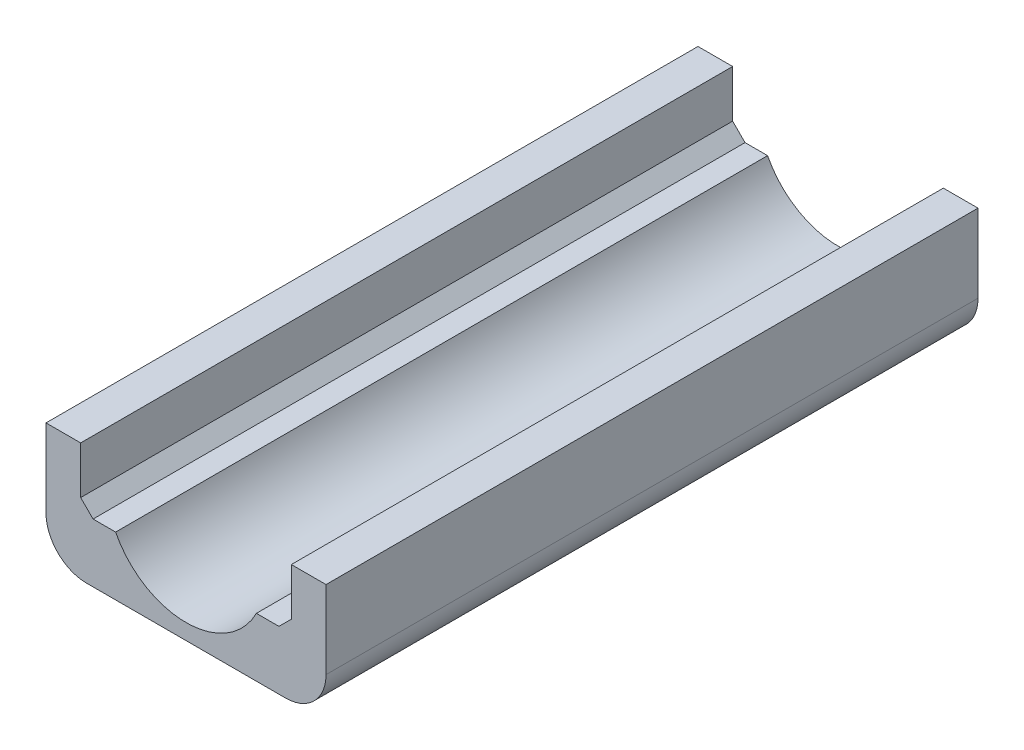
ISO-10303-21;
HEADER;
FILE_DESCRIPTION(('STEP AP214'),'2;1');
FILE_NAME('part.step','',(''),(''),'','','');
FILE_SCHEMA(('AUTOMOTIVE_DESIGN { 1 0 10303 214 1 1 1 1 }'));
ENDSEC;
DATA;
#1=APPLICATION_CONTEXT('core data for automotive mechanical design processes');
#2=APPLICATION_PROTOCOL_DEFINITION('international standard','automotive_design',2000,#1);
#3=PRODUCT_CONTEXT('',#1,'mechanical');
#4=PRODUCT('Part','Part','',(#3));
#5=PRODUCT_RELATED_PRODUCT_CATEGORY('part','',(#4));
#6=PRODUCT_DEFINITION_FORMATION('','',#4);
#7=PRODUCT_DEFINITION_CONTEXT('part definition',#1,'design');
#8=PRODUCT_DEFINITION('design','',#6,#7);
#9=PRODUCT_DEFINITION_SHAPE('','',#8);
#10=(LENGTH_UNIT() NAMED_UNIT(*) SI_UNIT(.MILLI.,.METRE.));
#11=(NAMED_UNIT(*) PLANE_ANGLE_UNIT() SI_UNIT($,.RADIAN.));
#12=(NAMED_UNIT(*) SI_UNIT($,.STERADIAN.) SOLID_ANGLE_UNIT());
#13=UNCERTAINTY_MEASURE_WITH_UNIT(LENGTH_MEASURE(1.E-05),#10,'distance_accuracy_value','');
#14=(GEOMETRIC_REPRESENTATION_CONTEXT(3) GLOBAL_UNCERTAINTY_ASSIGNED_CONTEXT((#13)) GLOBAL_UNIT_ASSIGNED_CONTEXT((#10,
#11,#12)) REPRESENTATION_CONTEXT('',''));
#15=CARTESIAN_POINT('',(0.,0.,0.));
#16=DIRECTION('',(0.,0.,1.));
#17=DIRECTION('',(1.,0.,0.));
#18=AXIS2_PLACEMENT_3D('',#15,#16,#17);
#19=CARTESIAN_POINT('',(12.0761564946184,23.3589104479386,161.));
#20=DIRECTION('',(0.,0.,-1.));
#21=DIRECTION('',(-1.,0.,0.));
#22=AXIS2_PLACEMENT_3D('',#19,#20,#21);
#23=CYLINDRICAL_SURFACE('',#22,19.5);
#24=CARTESIAN_POINT('',(12.0761564946184,23.3589104479386,0.));
#25=DIRECTION('',(0.,0.,-1.));
#26=DIRECTION('',(1.,0.,0.));
#27=AXIS2_PLACEMENT_3D('',#24,#25,#26);
#28=CIRCLE('',#27,19.5);
#29=CARTESIAN_POINT('',(29.4569599123131,14.5182276374623,0.));
#30=VERTEX_POINT('',#29);
#31=CARTESIAN_POINT('',(-5.30464692307629,14.5182276374623,0.));
#32=VERTEX_POINT('',#31);
#33=EDGE_CURVE('E182',#30,#32,#28,.T.);
#34=ORIENTED_EDGE('',*,*,#33,.T.);
#35=DIRECTION('',(0.,0.,-1.));
#36=VECTOR('',#35,1.);
#37=CARTESIAN_POINT('',(-5.30464692307629,14.5182276374623,161.));
#38=LINE('',#37,#36);
#39=CARTESIAN_POINT('',(-5.30464692307629,14.5182276374623,161.));
#40=VERTEX_POINT('',#39);
#41=EDGE_CURVE('E11',#40,#32,#38,.T.);
#42=ORIENTED_EDGE('',*,*,#41,.F.);
#43=CARTESIAN_POINT('',(12.0761564946184,23.3589104479386,161.));
#44=DIRECTION('',(0.,0.,-1.));
#45=DIRECTION('',(1.,0.,0.));
#46=AXIS2_PLACEMENT_3D('',#43,#44,#45);
#47=CIRCLE('',#46,19.5);
#48=CARTESIAN_POINT('',(29.4569599123131,14.5182276374623,161.));
#49=VERTEX_POINT('',#48);
#50=EDGE_CURVE('E222',#49,#40,#47,.T.);
#51=ORIENTED_EDGE('',*,*,#50,.F.);
#52=DIRECTION('',(0.,0.,-1.));
#53=VECTOR('',#52,1.);
#54=CARTESIAN_POINT('',(29.4569599123131,14.5182276374623,161.));
#55=LINE('',#54,#53);
#56=EDGE_CURVE('E178',#49,#30,#55,.T.);
#57=ORIENTED_EDGE('',*,*,#56,.T.);
#58=EDGE_LOOP('',(#34,#42,#51,#57));
#59=FACE_BOUND('',#58,.T.);
#60=ADVANCED_FACE('F45',(#59),#23,.F.);
#61=CARTESIAN_POINT('',(-10.8746469230763,14.5182276374622,161.));
#62=DIRECTION('',(0.,-1.,0.));
#63=DIRECTION('',(1.,0.,0.));
#64=AXIS2_PLACEMENT_3D('',#61,#62,#63);
#65=PLANE('',#64);
#66=DIRECTION('',(-1.,0.,0.));
#67=VECTOR('',#66,1.);
#68=CARTESIAN_POINT('',(-10.8746469230763,14.5182276374622,0.));
#69=LINE('',#68,#67);
#70=CARTESIAN_POINT('',(-10.8746469230763,14.5182276374622,0.));
#71=VERTEX_POINT('',#70);
#72=EDGE_CURVE('E186',#32,#71,#69,.T.);
#73=ORIENTED_EDGE('',*,*,#72,.T.);
#74=DIRECTION('',(0.,0.,-1.));
#75=VECTOR('',#74,1.);
#76=CARTESIAN_POINT('',(-10.8746469230763,14.5182276374622,161.));
#77=LINE('',#76,#75);
#78=CARTESIAN_POINT('',(-10.8746469230763,14.5182276374622,161.));
#79=VERTEX_POINT('',#78);
#80=EDGE_CURVE('E54',#79,#71,#77,.T.);
#81=ORIENTED_EDGE('',*,*,#80,.F.);
#82=DIRECTION('',(-1.,0.,0.));
#83=VECTOR('',#82,1.);
#84=CARTESIAN_POINT('',(-10.8746469230763,14.5182276374622,161.));
#85=LINE('',#84,#83);
#86=EDGE_CURVE('E123',#40,#79,#85,.T.);
#87=ORIENTED_EDGE('',*,*,#86,.F.);
#88=ORIENTED_EDGE('',*,*,#41,.T.);
#89=EDGE_LOOP('',(#73,#81,#87,#88));
#90=FACE_BOUND('',#89,.T.);
#91=ADVANCED_FACE('F330',(#90),#65,.F.);
#92=CARTESIAN_POINT('',(-13.936419285614,17.58,161.));
#93=DIRECTION('',(-0.707106781186547,-0.707106781186547,0.));
#94=DIRECTION('',(0.707106781186548,-0.707106781186548,0.));
#95=AXIS2_PLACEMENT_3D('',#92,#93,#94);
#96=PLANE('',#95);
#97=DIRECTION('',(-0.707106781186548,0.707106781186548,0.));
#98=VECTOR('',#97,1.);
#99=CARTESIAN_POINT('',(-13.936419285614,17.58,0.));
#100=LINE('',#99,#98);
#101=CARTESIAN_POINT('',(-13.936419285614,17.58,0.));
#102=VERTEX_POINT('',#101);
#103=EDGE_CURVE('E189',#71,#102,#100,.T.);
#104=ORIENTED_EDGE('',*,*,#103,.T.);
#105=DIRECTION('',(0.,0.,-1.));
#106=VECTOR('',#105,1.);
#107=CARTESIAN_POINT('',(-13.936419285614,17.58,161.));
#108=LINE('',#107,#106);
#109=CARTESIAN_POINT('',(-13.936419285614,17.58,161.));
#110=VERTEX_POINT('',#109);
#111=EDGE_CURVE('E257',#110,#102,#108,.T.);
#112=ORIENTED_EDGE('',*,*,#111,.F.);
#113=DIRECTION('',(-0.707106781186548,0.707106781186548,0.));
#114=VECTOR('',#113,1.);
#115=CARTESIAN_POINT('',(-13.936419285614,17.58,161.));
#116=LINE('',#115,#114);
#117=EDGE_CURVE('E267',#79,#110,#116,.T.);
#118=ORIENTED_EDGE('',*,*,#117,.F.);
#119=ORIENTED_EDGE('',*,*,#80,.T.);
#120=EDGE_LOOP('',(#104,#112,#118,#119));
#121=FACE_BOUND('',#120,.T.);
#122=ADVANCED_FACE('F265',(#121),#96,.F.);
#123=CARTESIAN_POINT('',(-13.936419285614,29.27,161.));
#124=DIRECTION('',(-1.,0.,0.));
#125=DIRECTION('',(0.,0.,1.));
#126=AXIS2_PLACEMENT_3D('',#123,#124,#125);
#127=PLANE('',#126);
#128=DIRECTION('',(0.,1.,0.));
#129=VECTOR('',#128,1.);
#130=CARTESIAN_POINT('',(-13.936419285614,29.27,0.));
#131=LINE('',#130,#129);
#132=CARTESIAN_POINT('',(-13.936419285614,29.27,0.));
#133=VERTEX_POINT('',#132);
#134=EDGE_CURVE('E192',#102,#133,#131,.T.);
#135=ORIENTED_EDGE('',*,*,#134,.T.);
#136=DIRECTION('',(0.,0.,-1.));
#137=VECTOR('',#136,1.);
#138=CARTESIAN_POINT('',(-13.936419285614,29.27,161.));
#139=LINE('',#138,#137);
#140=CARTESIAN_POINT('',(-13.936419285614,29.27,161.));
#141=VERTEX_POINT('',#140);
#142=EDGE_CURVE('E253',#141,#133,#139,.T.);
#143=ORIENTED_EDGE('',*,*,#142,.F.);
#144=DIRECTION('',(0.,1.,0.));
#145=VECTOR('',#144,1.);
#146=CARTESIAN_POINT('',(-13.936419285614,29.27,161.));
#147=LINE('',#146,#145);
#148=EDGE_CURVE('E286',#110,#141,#147,.T.);
#149=ORIENTED_EDGE('',*,*,#148,.F.);
#150=ORIENTED_EDGE('',*,*,#111,.T.);
#151=EDGE_LOOP('',(#135,#143,#149,#150));
#152=FACE_BOUND('',#151,.T.);
#153=ADVANCED_FACE('F276',(#152),#127,.F.);
#154=CARTESIAN_POINT('',(-22.496419285614,29.27,161.));
#155=DIRECTION('',(0.,-1.,0.));
#156=DIRECTION('',(1.,0.,0.));
#157=AXIS2_PLACEMENT_3D('',#154,#155,#156);
#158=PLANE('',#157);
#159=DIRECTION('',(-1.,0.,0.));
#160=VECTOR('',#159,1.);
#161=CARTESIAN_POINT('',(-22.496419285614,29.27,0.));
#162=LINE('',#161,#160);
#163=CARTESIAN_POINT('',(-22.496419285614,29.27,0.));
#164=VERTEX_POINT('',#163);
#165=EDGE_CURVE('E195',#133,#164,#162,.T.);
#166=ORIENTED_EDGE('',*,*,#165,.T.);
#167=DIRECTION('',(0.,0.,-1.));
#168=VECTOR('',#167,1.);
#169=CARTESIAN_POINT('',(-22.496419285614,29.27,161.));
#170=LINE('',#169,#168);
#171=CARTESIAN_POINT('',(-22.496419285614,29.27,161.));
#172=VERTEX_POINT('',#171);
#173=EDGE_CURVE('E249',#172,#164,#170,.T.);
#174=ORIENTED_EDGE('',*,*,#173,.F.);
#175=DIRECTION('',(-1.,0.,0.));
#176=VECTOR('',#175,1.);
#177=CARTESIAN_POINT('',(-22.496419285614,29.27,161.));
#178=LINE('',#177,#176);
#179=EDGE_CURVE('E282',#141,#172,#178,.T.);
#180=ORIENTED_EDGE('',*,*,#179,.F.);
#181=ORIENTED_EDGE('',*,*,#142,.T.);
#182=EDGE_LOOP('',(#166,#174,#180,#181));
#183=FACE_BOUND('',#182,.T.);
#184=ADVANCED_FACE('F280',(#183),#158,.F.);
#185=CARTESIAN_POINT('',(-22.496419285614,29.27,161.));
#186=DIRECTION('',(1.,0.,0.));
#187=DIRECTION('',(0.,0.,-1.));
#188=AXIS2_PLACEMENT_3D('',#185,#186,#187);
#189=PLANE('',#188);
#190=DIRECTION('',(0.,-1.,0.));
#191=VECTOR('',#190,1.);
#192=CARTESIAN_POINT('',(-22.496419285614,29.27,0.));
#193=LINE('',#192,#191);
#194=CARTESIAN_POINT('',(-22.496419285614,10.,0.));
#195=VERTEX_POINT('',#194);
#196=EDGE_CURVE('E198',#164,#195,#193,.T.);
#197=ORIENTED_EDGE('',*,*,#196,.T.);
#198=DIRECTION('',(0.,0.,-1.));
#199=VECTOR('',#198,1.);
#200=CARTESIAN_POINT('',(-22.496419285614,10.,161.));
#201=LINE('',#200,#199);
#202=CARTESIAN_POINT('',(-22.496419285614,10.,161.));
#203=VERTEX_POINT('',#202);
#204=EDGE_CURVE('E245',#203,#195,#201,.T.);
#205=ORIENTED_EDGE('',*,*,#204,.F.);
#206=DIRECTION('',(0.,-1.,0.));
#207=VECTOR('',#206,1.);
#208=CARTESIAN_POINT('',(-22.496419285614,29.27,161.));
#209=LINE('',#208,#207);
#210=EDGE_CURVE('E285',#172,#203,#209,.T.);
#211=ORIENTED_EDGE('',*,*,#210,.F.);
#212=ORIENTED_EDGE('',*,*,#173,.T.);
#213=EDGE_LOOP('',(#197,#205,#211,#212));
#214=FACE_BOUND('',#213,.T.);
#215=ADVANCED_FACE('F343',(#214),#189,.F.);
#216=CARTESIAN_POINT('',(-12.496419285614,10.,161.));
#217=DIRECTION('',(0.,0.,-1.));
#218=DIRECTION('',(-1.,0.,0.));
#219=AXIS2_PLACEMENT_3D('',#216,#217,#218);
#220=CYLINDRICAL_SURFACE('',#219,10.);
#221=CARTESIAN_POINT('',(-12.496419285614,10.,0.));
#222=DIRECTION('',(0.,0.,1.));
#223=DIRECTION('',(-1.,0.,0.));
#224=AXIS2_PLACEMENT_3D('',#221,#222,#223);
#225=CIRCLE('',#224,10.);
#226=CARTESIAN_POINT('',(-12.496419285614,0.,0.));
#227=VERTEX_POINT('',#226);
#228=EDGE_CURVE('E201',#195,#227,#225,.T.);
#229=ORIENTED_EDGE('',*,*,#228,.T.);
#230=DIRECTION('',(0.,0.,-1.));
#231=VECTOR('',#230,1.);
#232=CARTESIAN_POINT('',(-12.496419285614,0.,161.));
#233=LINE('',#232,#231);
#234=CARTESIAN_POINT('',(-12.496419285614,0.,161.));
#235=VERTEX_POINT('',#234);
#236=EDGE_CURVE('E241',#235,#227,#233,.T.);
#237=ORIENTED_EDGE('',*,*,#236,.F.);
#238=CARTESIAN_POINT('',(-12.496419285614,10.,161.));
#239=DIRECTION('',(0.,0.,1.));
#240=DIRECTION('',(-1.,0.,0.));
#241=AXIS2_PLACEMENT_3D('',#238,#239,#240);
#242=CIRCLE('',#241,10.);
#243=EDGE_CURVE('E290',#203,#235,#242,.T.);
#244=ORIENTED_EDGE('',*,*,#243,.F.);
#245=ORIENTED_EDGE('',*,*,#204,.T.);
#246=EDGE_LOOP('',(#229,#237,#244,#245));
#247=FACE_BOUND('',#246,.T.);
#248=ADVANCED_FACE('F346',(#247),#220,.T.);
#249=CARTESIAN_POINT('',(-12.496419285614,0.,161.));
#250=DIRECTION('',(0.,1.,0.));
#251=DIRECTION('',(0.,0.,1.));
#252=AXIS2_PLACEMENT_3D('',#249,#250,#251);
#253=PLANE('',#252);
#254=DIRECTION('',(1.,0.,0.));
#255=VECTOR('',#254,1.);
#256=CARTESIAN_POINT('',(-12.496419285614,0.,0.));
#257=LINE('',#256,#255);
#258=CARTESIAN_POINT('',(36.6487322748508,0.,0.));
#259=VERTEX_POINT('',#258);
#260=EDGE_CURVE('E204',#227,#259,#257,.T.);
#261=ORIENTED_EDGE('',*,*,#260,.T.);
#262=DIRECTION('',(0.,0.,-1.));
#263=VECTOR('',#262,1.);
#264=CARTESIAN_POINT('',(36.6487322748508,0.,161.));
#265=LINE('',#264,#263);
#266=CARTESIAN_POINT('',(36.6487322748508,0.,161.));
#267=VERTEX_POINT('',#266);
#268=EDGE_CURVE('E237',#267,#259,#265,.T.);
#269=ORIENTED_EDGE('',*,*,#268,.F.);
#270=DIRECTION('',(1.,0.,0.));
#271=VECTOR('',#270,1.);
#272=CARTESIAN_POINT('',(-12.496419285614,0.,161.));
#273=LINE('',#272,#271);
#274=EDGE_CURVE('E297',#235,#267,#273,.T.);
#275=ORIENTED_EDGE('',*,*,#274,.F.);
#276=ORIENTED_EDGE('',*,*,#236,.T.);
#277=EDGE_LOOP('',(#261,#269,#275,#276));
#278=FACE_BOUND('',#277,.T.);
#279=ADVANCED_FACE('F350',(#278),#253,.F.);
#280=CARTESIAN_POINT('',(36.6487322748509,10.,161.));
#281=DIRECTION('',(0.,0.,-1.));
#282=DIRECTION('',(-1.,0.,0.));
#283=AXIS2_PLACEMENT_3D('',#280,#281,#282);
#284=CYLINDRICAL_SURFACE('',#283,10.);
#285=CARTESIAN_POINT('',(36.6487322748509,10.,0.));
#286=DIRECTION('',(0.,0.,1.));
#287=DIRECTION('',(1.,0.,0.));
#288=AXIS2_PLACEMENT_3D('',#285,#286,#287);
#289=CIRCLE('',#288,10.);
#290=CARTESIAN_POINT('',(46.6487322748509,10.0000000000001,0.));
#291=VERTEX_POINT('',#290);
#292=EDGE_CURVE('E207',#259,#291,#289,.T.);
#293=ORIENTED_EDGE('',*,*,#292,.T.);
#294=DIRECTION('',(0.,0.,-1.));
#295=VECTOR('',#294,1.);
#296=CARTESIAN_POINT('',(46.6487322748509,10.0000000000001,161.));
#297=LINE('',#296,#295);
#298=CARTESIAN_POINT('',(46.6487322748509,10.0000000000001,161.));
#299=VERTEX_POINT('',#298);
#300=EDGE_CURVE('E233',#299,#291,#297,.T.);
#301=ORIENTED_EDGE('',*,*,#300,.F.);
#302=CARTESIAN_POINT('',(36.6487322748509,10.,161.));
#303=DIRECTION('',(0.,0.,1.));
#304=DIRECTION('',(1.,0.,0.));
#305=AXIS2_PLACEMENT_3D('',#302,#303,#304);
#306=CIRCLE('',#305,10.);
#307=EDGE_CURVE('E300',#267,#299,#306,.T.);
#308=ORIENTED_EDGE('',*,*,#307,.F.);
#309=ORIENTED_EDGE('',*,*,#268,.T.);
#310=EDGE_LOOP('',(#293,#301,#308,#309));
#311=FACE_BOUND('',#310,.T.);
#312=ADVANCED_FACE('F354',(#311),#284,.T.);
#313=CARTESIAN_POINT('',(46.6487322748509,29.27,161.));
#314=DIRECTION('',(-1.,0.,0.));
#315=DIRECTION('',(0.,0.,1.));
#316=AXIS2_PLACEMENT_3D('',#313,#314,#315);
#317=PLANE('',#316);
#318=DIRECTION('',(0.,1.,0.));
#319=VECTOR('',#318,1.);
#320=CARTESIAN_POINT('',(46.6487322748509,29.27,0.));
#321=LINE('',#320,#319);
#322=CARTESIAN_POINT('',(46.6487322748509,29.27,0.));
#323=VERTEX_POINT('',#322);
#324=EDGE_CURVE('E210',#291,#323,#321,.T.);
#325=ORIENTED_EDGE('',*,*,#324,.T.);
#326=DIRECTION('',(0.,0.,-1.));
#327=VECTOR('',#326,1.);
#328=CARTESIAN_POINT('',(46.6487322748509,29.27,161.));
#329=LINE('',#328,#327);
#330=CARTESIAN_POINT('',(46.6487322748509,29.27,161.));
#331=VERTEX_POINT('',#330);
#332=EDGE_CURVE('E229',#331,#323,#329,.T.);
#333=ORIENTED_EDGE('',*,*,#332,.F.);
#334=DIRECTION('',(0.,1.,0.));
#335=VECTOR('',#334,1.);
#336=CARTESIAN_POINT('',(46.6487322748509,29.27,161.));
#337=LINE('',#336,#335);
#338=EDGE_CURVE('E303',#299,#331,#337,.T.);
#339=ORIENTED_EDGE('',*,*,#338,.F.);
#340=ORIENTED_EDGE('',*,*,#300,.T.);
#341=EDGE_LOOP('',(#325,#333,#339,#340));
#342=FACE_BOUND('',#341,.T.);
#343=ADVANCED_FACE('F311',(#342),#317,.F.);
#344=CARTESIAN_POINT('',(46.6487322748509,29.27,161.));
#345=DIRECTION('',(0.,-1.,0.));
#346=DIRECTION('',(1.,0.,0.));
#347=AXIS2_PLACEMENT_3D('',#344,#345,#346);
#348=PLANE('',#347);
#349=DIRECTION('',(-1.,0.,0.));
#350=VECTOR('',#349,1.);
#351=CARTESIAN_POINT('',(46.6487322748509,29.27,0.));
#352=LINE('',#351,#350);
#353=CARTESIAN_POINT('',(38.0887322748509,29.27,0.));
#354=VERTEX_POINT('',#353);
#355=EDGE_CURVE('E213',#323,#354,#352,.T.);
#356=ORIENTED_EDGE('',*,*,#355,.T.);
#357=DIRECTION('',(0.,0.,-1.));
#358=VECTOR('',#357,1.);
#359=CARTESIAN_POINT('',(38.0887322748509,29.27,161.));
#360=LINE('',#359,#358);
#361=CARTESIAN_POINT('',(38.0887322748509,29.27,161.));
#362=VERTEX_POINT('',#361);
#363=EDGE_CURVE('E171',#362,#354,#360,.T.);
#364=ORIENTED_EDGE('',*,*,#363,.F.);
#365=DIRECTION('',(-1.,0.,0.));
#366=VECTOR('',#365,1.);
#367=CARTESIAN_POINT('',(46.6487322748509,29.27,161.));
#368=LINE('',#367,#366);
#369=EDGE_CURVE('E160',#331,#362,#368,.T.);
#370=ORIENTED_EDGE('',*,*,#369,.F.);
#371=ORIENTED_EDGE('',*,*,#332,.T.);
#372=EDGE_LOOP('',(#356,#364,#370,#371));
#373=FACE_BOUND('',#372,.T.);
#374=ADVANCED_FACE('F315',(#373),#348,.F.);
#375=CARTESIAN_POINT('',(38.0887322748509,29.27,161.));
#376=DIRECTION('',(1.,0.,0.));
#377=DIRECTION('',(0.,0.,-1.));
#378=AXIS2_PLACEMENT_3D('',#375,#376,#377);
#379=PLANE('',#378);
#380=DIRECTION('',(0.,-1.,0.));
#381=VECTOR('',#380,1.);
#382=CARTESIAN_POINT('',(38.0887322748509,29.27,0.));
#383=LINE('',#382,#381);
#384=CARTESIAN_POINT('',(38.0887322748509,17.58,0.));
#385=VERTEX_POINT('',#384);
#386=EDGE_CURVE('E169',#354,#385,#383,.T.);
#387=ORIENTED_EDGE('',*,*,#386,.T.);
#388=DIRECTION('',(0.,0.,-1.));
#389=VECTOR('',#388,1.);
#390=CARTESIAN_POINT('',(38.0887322748509,17.58,161.));
#391=LINE('',#390,#389);
#392=CARTESIAN_POINT('',(38.0887322748509,17.58,161.));
#393=VERTEX_POINT('',#392);
#394=EDGE_CURVE('E166',#393,#385,#391,.T.);
#395=ORIENTED_EDGE('',*,*,#394,.F.);
#396=DIRECTION('',(0.,-1.,0.));
#397=VECTOR('',#396,1.);
#398=CARTESIAN_POINT('',(38.0887322748509,29.27,161.));
#399=LINE('',#398,#397);
#400=EDGE_CURVE('E154',#362,#393,#399,.T.);
#401=ORIENTED_EDGE('',*,*,#400,.F.);
#402=ORIENTED_EDGE('',*,*,#363,.T.);
#403=EDGE_LOOP('',(#387,#395,#401,#402));
#404=FACE_BOUND('',#403,.T.);
#405=ADVANCED_FACE('F167',(#404),#379,.F.);
#406=CARTESIAN_POINT('',(38.0887322748509,17.58,161.));
#407=DIRECTION('',(0.707106781186546,-0.707106781186549,0.));
#408=DIRECTION('',(0.707106781186549,0.707106781186546,0.));
#409=AXIS2_PLACEMENT_3D('',#406,#407,#408);
#410=PLANE('',#409);
#411=DIRECTION('',(-0.707106781186549,-0.707106781186546,0.));
#412=VECTOR('',#411,1.);
#413=CARTESIAN_POINT('',(38.0887322748509,17.58,0.));
#414=LINE('',#413,#412);
#415=CARTESIAN_POINT('',(35.0269599123132,14.5182276374622,0.));
#416=VERTEX_POINT('',#415);
#417=EDGE_CURVE('E109',#385,#416,#414,.T.);
#418=ORIENTED_EDGE('',*,*,#417,.T.);
#419=DIRECTION('',(0.,0.,-1.));
#420=VECTOR('',#419,1.);
#421=CARTESIAN_POINT('',(35.0269599123132,14.5182276374622,161.));
#422=LINE('',#421,#420);
#423=CARTESIAN_POINT('',(35.0269599123132,14.5182276374622,161.));
#424=VERTEX_POINT('',#423);
#425=EDGE_CURVE('E172',#424,#416,#422,.T.);
#426=ORIENTED_EDGE('',*,*,#425,.F.);
#427=DIRECTION('',(-0.707106781186549,-0.707106781186546,0.));
#428=VECTOR('',#427,1.);
#429=CARTESIAN_POINT('',(38.0887322748509,17.58,161.));
#430=LINE('',#429,#428);
#431=EDGE_CURVE('E158',#393,#424,#430,.T.);
#432=ORIENTED_EDGE('',*,*,#431,.F.);
#433=ORIENTED_EDGE('',*,*,#394,.T.);
#434=EDGE_LOOP('',(#418,#426,#432,#433));
#435=FACE_BOUND('',#434,.T.);
#436=ADVANCED_FACE('F174',(#435),#410,.F.);
#437=CARTESIAN_POINT('',(35.0269599123132,14.5182276374622,161.));
#438=DIRECTION('',(0.,-1.,0.));
#439=DIRECTION('',(1.,0.,0.));
#440=AXIS2_PLACEMENT_3D('',#437,#438,#439);
#441=PLANE('',#440);
#442=DIRECTION('',(-1.,0.,0.));
#443=VECTOR('',#442,1.);
#444=CARTESIAN_POINT('',(35.0269599123132,14.5182276374622,0.));
#445=LINE('',#444,#443);
#446=EDGE_CURVE('E115',#416,#30,#445,.T.);
#447=ORIENTED_EDGE('',*,*,#446,.T.);
#448=ORIENTED_EDGE('',*,*,#56,.F.);
#449=DIRECTION('',(-1.,0.,0.));
#450=VECTOR('',#449,1.);
#451=CARTESIAN_POINT('',(35.0269599123132,14.5182276374622,161.));
#452=LINE('',#451,#450);
#453=EDGE_CURVE('E62',#424,#49,#452,.T.);
#454=ORIENTED_EDGE('',*,*,#453,.F.);
#455=ORIENTED_EDGE('',*,*,#425,.T.);
#456=EDGE_LOOP('',(#447,#448,#454,#455));
#457=FACE_BOUND('',#456,.T.);
#458=ADVANCED_FACE('F319',(#457),#441,.F.);
#459=CARTESIAN_POINT('',(12.0761564946184,23.3589104479386,161.));
#460=DIRECTION('',(0.,0.,1.));
#461=DIRECTION('',(1.,0.,0.));
#462=AXIS2_PLACEMENT_3D('',#459,#460,#461);
#463=PLANE('',#462);
#464=ORIENTED_EDGE('',*,*,#50,.T.);
#465=ORIENTED_EDGE('',*,*,#86,.T.);
#466=ORIENTED_EDGE('',*,*,#117,.T.);
#467=ORIENTED_EDGE('',*,*,#148,.T.);
#468=ORIENTED_EDGE('',*,*,#179,.T.);
#469=ORIENTED_EDGE('',*,*,#210,.T.);
#470=ORIENTED_EDGE('',*,*,#243,.T.);
#471=ORIENTED_EDGE('',*,*,#274,.T.);
#472=ORIENTED_EDGE('',*,*,#307,.T.);
#473=ORIENTED_EDGE('',*,*,#338,.T.);
#474=ORIENTED_EDGE('',*,*,#369,.T.);
#475=ORIENTED_EDGE('',*,*,#400,.T.);
#476=ORIENTED_EDGE('',*,*,#431,.T.);
#477=ORIENTED_EDGE('',*,*,#453,.T.);
#478=EDGE_LOOP('',(#464,#465,#466,#467,#468,#469,#470,#471,#472,#473,#474,#475,#476,#477));
#479=FACE_BOUND('',#478,.T.);
#480=ADVANCED_FACE('F156',(#479),#463,.T.);
#481=CARTESIAN_POINT('',(12.0761564946184,23.3589104479386,0.));
#482=DIRECTION('',(0.,0.,1.));
#483=DIRECTION('',(1.,0.,0.));
#484=AXIS2_PLACEMENT_3D('',#481,#482,#483);
#485=PLANE('',#484);
#486=ORIENTED_EDGE('',*,*,#33,.F.);
#487=ORIENTED_EDGE('',*,*,#446,.F.);
#488=ORIENTED_EDGE('',*,*,#417,.F.);
#489=ORIENTED_EDGE('',*,*,#386,.F.);
#490=ORIENTED_EDGE('',*,*,#355,.F.);
#491=ORIENTED_EDGE('',*,*,#324,.F.);
#492=ORIENTED_EDGE('',*,*,#292,.F.);
#493=ORIENTED_EDGE('',*,*,#260,.F.);
#494=ORIENTED_EDGE('',*,*,#228,.F.);
#495=ORIENTED_EDGE('',*,*,#196,.F.);
#496=ORIENTED_EDGE('',*,*,#165,.F.);
#497=ORIENTED_EDGE('',*,*,#134,.F.);
#498=ORIENTED_EDGE('',*,*,#103,.F.);
#499=ORIENTED_EDGE('',*,*,#72,.F.);
#500=EDGE_LOOP('',(#486,#487,#488,#489,#490,#491,#492,#493,#494,#495,#496,#497,#498,#499));
#501=FACE_BOUND('',#500,.T.);
#502=ADVANCED_FACE('F271',(#501),#485,.F.);
#503=CLOSED_SHELL('',(#60,#91,#122,#153,#184,#215,#248,#279,#312,#343,#374,#405,#436,#458,#480,#502));
#504=MANIFOLD_SOLID_BREP('B2',#503);
#505=ADVANCED_BREP_SHAPE_REPRESENTATION('',(#18,#504),#14);
#506=SHAPE_DEFINITION_REPRESENTATION(#9,#505);
ENDSEC;
END-ISO-10303-21;
